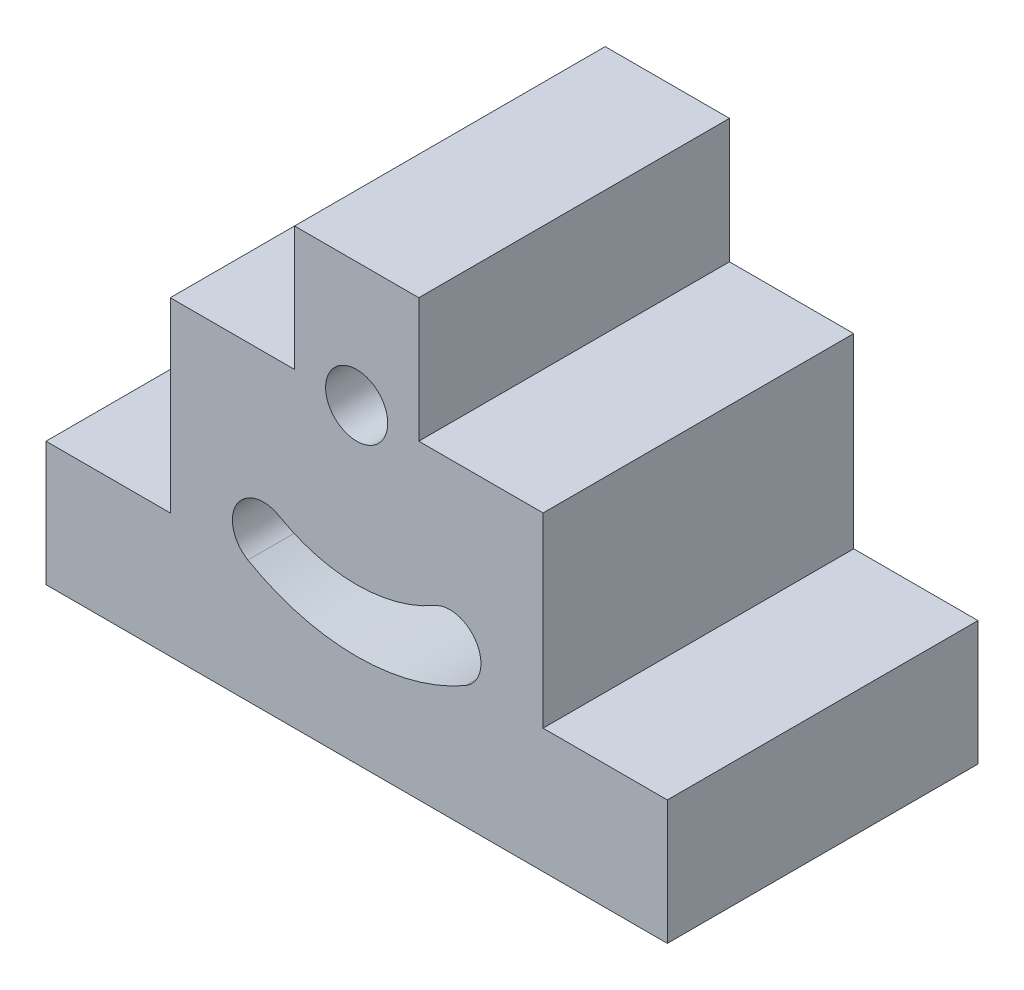
ISO-10303-21;
HEADER;
FILE_DESCRIPTION(('STEP AP214'),'2;1');
FILE_NAME('part.step','',(''),(''),'','','');
FILE_SCHEMA(('AUTOMOTIVE_DESIGN { 1 0 10303 214 1 1 1 1 }'));
ENDSEC;
DATA;
#1=APPLICATION_CONTEXT('core data for automotive mechanical design processes');
#2=APPLICATION_PROTOCOL_DEFINITION('international standard','automotive_design',2000,#1);
#3=PRODUCT_CONTEXT('',#1,'mechanical');
#4=PRODUCT('Part','Part','',(#3));
#5=PRODUCT_RELATED_PRODUCT_CATEGORY('part','',(#4));
#6=PRODUCT_DEFINITION_FORMATION('','',#4);
#7=PRODUCT_DEFINITION_CONTEXT('part definition',#1,'design');
#8=PRODUCT_DEFINITION('design','',#6,#7);
#9=PRODUCT_DEFINITION_SHAPE('','',#8);
#10=(LENGTH_UNIT() NAMED_UNIT(*) SI_UNIT(.MILLI.,.METRE.));
#11=(NAMED_UNIT(*) PLANE_ANGLE_UNIT() SI_UNIT($,.RADIAN.));
#12=(NAMED_UNIT(*) SI_UNIT($,.STERADIAN.) SOLID_ANGLE_UNIT());
#13=UNCERTAINTY_MEASURE_WITH_UNIT(LENGTH_MEASURE(1.E-05),#10,'distance_accuracy_value','');
#14=(GEOMETRIC_REPRESENTATION_CONTEXT(3) GLOBAL_UNCERTAINTY_ASSIGNED_CONTEXT((#13)) GLOBAL_UNIT_ASSIGNED_CONTEXT((#10,
#11,#12)) REPRESENTATION_CONTEXT('',''));
#15=CARTESIAN_POINT('',(0.,0.,0.));
#16=DIRECTION('',(0.,0.,1.));
#17=DIRECTION('',(1.,0.,0.));
#18=AXIS2_PLACEMENT_3D('',#15,#16,#17);
#19=CARTESIAN_POINT('',(0.,0.,2.5));
#20=DIRECTION('',(0.,0.,1.));
#21=DIRECTION('',(1.,0.,0.));
#22=AXIS2_PLACEMENT_3D('',#19,#20,#21);
#23=PLANE('',#22);
#24=CARTESIAN_POINT('',(0.,4.99999999999773,2.5));
#25=DIRECTION('',(0.,0.,1.));
#26=DIRECTION('',(1.,0.,0.));
#27=AXIS2_PLACEMENT_3D('',#24,#25,#26);
#28=CIRCLE('',#27,3.5);
#29=CARTESIAN_POINT('',(-1.75,1.96891108675219,2.5));
#30=VERTEX_POINT('',#29);
#31=CARTESIAN_POINT('',(1.75,1.96891108675219,2.5));
#32=VERTEX_POINT('',#31);
#33=EDGE_CURVE('E168',#30,#32,#28,.T.);
#34=ORIENTED_EDGE('',*,*,#33,.F.);
#35=CARTESIAN_POINT('',(-1.5,2.40192378864441,2.5));
#36=DIRECTION('',(0.,0.,1.));
#37=DIRECTION('',(1.,0.,0.));
#38=AXIS2_PLACEMENT_3D('',#35,#36,#37);
#39=CIRCLE('',#38,0.5);
#40=CARTESIAN_POINT('',(-1.25,2.83493649053663,2.5));
#41=VERTEX_POINT('',#40);
#42=EDGE_CURVE('E159',#41,#30,#39,.T.);
#43=ORIENTED_EDGE('',*,*,#42,.F.);
#44=CARTESIAN_POINT('',(0.,4.99999999999773,2.5));
#45=DIRECTION('',(0.,0.,-1.));
#46=DIRECTION('',(1.,0.,0.));
#47=AXIS2_PLACEMENT_3D('',#44,#45,#46);
#48=CIRCLE('',#47,2.5);
#49=CARTESIAN_POINT('',(1.25,2.83493649053663,2.5));
#50=VERTEX_POINT('',#49);
#51=EDGE_CURVE('E186',#50,#41,#48,.T.);
#52=ORIENTED_EDGE('',*,*,#51,.F.);
#53=CARTESIAN_POINT('',(1.5,2.40192378864441,2.5));
#54=DIRECTION('',(0.,0.,1.));
#55=DIRECTION('',(1.,0.,0.));
#56=AXIS2_PLACEMENT_3D('',#53,#54,#55);
#57=CIRCLE('',#56,0.5);
#58=EDGE_CURVE('E182',#32,#50,#57,.T.);
#59=ORIENTED_EDGE('',*,*,#58,.F.);
#60=EDGE_LOOP('',(#34,#43,#52,#59));
#61=FACE_BOUND('',#60,.T.);
#62=DIRECTION('',(-1.,0.,0.));
#63=VECTOR('',#62,1.);
#64=CARTESIAN_POINT('',(-5.,2.,2.5));
#65=LINE('',#64,#63);
#66=CARTESIAN_POINT('',(-3.,2.,2.5));
#67=VERTEX_POINT('',#66);
#68=CARTESIAN_POINT('',(-5.,2.,2.5));
#69=VERTEX_POINT('',#68);
#70=EDGE_CURVE('E210',#67,#69,#65,.T.);
#71=ORIENTED_EDGE('',*,*,#70,.T.);
#72=DIRECTION('',(0.,-1.,0.));
#73=VECTOR('',#72,1.);
#74=CARTESIAN_POINT('',(-5.,0.,2.5));
#75=LINE('',#74,#73);
#76=CARTESIAN_POINT('',(-5.,0.,2.5));
#77=VERTEX_POINT('',#76);
#78=EDGE_CURVE('E214',#69,#77,#75,.T.);
#79=ORIENTED_EDGE('',*,*,#78,.T.);
#80=DIRECTION('',(1.,0.,0.));
#81=VECTOR('',#80,1.);
#82=CARTESIAN_POINT('',(-5.,0.,2.5));
#83=LINE('',#82,#81);
#84=CARTESIAN_POINT('',(5.,0.,2.5));
#85=VERTEX_POINT('',#84);
#86=EDGE_CURVE('E218',#77,#85,#83,.T.);
#87=ORIENTED_EDGE('',*,*,#86,.T.);
#88=DIRECTION('',(0.,1.,0.));
#89=VECTOR('',#88,1.);
#90=CARTESIAN_POINT('',(5.,0.,2.5));
#91=LINE('',#90,#89);
#92=CARTESIAN_POINT('',(5.,2.,2.5));
#93=VERTEX_POINT('',#92);
#94=EDGE_CURVE('E221',#85,#93,#91,.T.);
#95=ORIENTED_EDGE('',*,*,#94,.T.);
#96=DIRECTION('',(-1.,0.,0.));
#97=VECTOR('',#96,1.);
#98=CARTESIAN_POINT('',(5.,2.,2.5));
#99=LINE('',#98,#97);
#100=CARTESIAN_POINT('',(3.,2.,2.5));
#101=VERTEX_POINT('',#100);
#102=EDGE_CURVE('E224',#93,#101,#99,.T.);
#103=ORIENTED_EDGE('',*,*,#102,.T.);
#104=DIRECTION('',(0.,1.,0.));
#105=VECTOR('',#104,1.);
#106=CARTESIAN_POINT('',(3.,2.,2.5));
#107=LINE('',#106,#105);
#108=CARTESIAN_POINT('',(3.,5.,2.5));
#109=VERTEX_POINT('',#108);
#110=EDGE_CURVE('E227',#101,#109,#107,.T.);
#111=ORIENTED_EDGE('',*,*,#110,.T.);
#112=DIRECTION('',(-1.,0.,0.));
#113=VECTOR('',#112,1.);
#114=CARTESIAN_POINT('',(3.,5.,2.5));
#115=LINE('',#114,#113);
#116=CARTESIAN_POINT('',(1.,5.,2.5));
#117=VERTEX_POINT('',#116);
#118=EDGE_CURVE('E230',#109,#117,#115,.T.);
#119=ORIENTED_EDGE('',*,*,#118,.T.);
#120=DIRECTION('',(0.,1.,0.));
#121=VECTOR('',#120,1.);
#122=CARTESIAN_POINT('',(1.,5.,2.5));
#123=LINE('',#122,#121);
#124=CARTESIAN_POINT('',(1.,7.,2.5));
#125=VERTEX_POINT('',#124);
#126=EDGE_CURVE('E233',#117,#125,#123,.T.);
#127=ORIENTED_EDGE('',*,*,#126,.T.);
#128=DIRECTION('',(-1.,0.,0.));
#129=VECTOR('',#128,1.);
#130=CARTESIAN_POINT('',(1.,7.,2.5));
#131=LINE('',#130,#129);
#132=CARTESIAN_POINT('',(-0.999999999999999,7.,2.5));
#133=VERTEX_POINT('',#132);
#134=EDGE_CURVE('E236',#125,#133,#131,.T.);
#135=ORIENTED_EDGE('',*,*,#134,.T.);
#136=DIRECTION('',(0.,-1.,0.));
#137=VECTOR('',#136,1.);
#138=CARTESIAN_POINT('',(-1.,5.,2.5));
#139=LINE('',#138,#137);
#140=CARTESIAN_POINT('',(-1.,5.,2.5));
#141=VERTEX_POINT('',#140);
#142=EDGE_CURVE('E239',#133,#141,#139,.T.);
#143=ORIENTED_EDGE('',*,*,#142,.T.);
#144=DIRECTION('',(-1.,0.,0.));
#145=VECTOR('',#144,1.);
#146=CARTESIAN_POINT('',(-3.,5.,2.5));
#147=LINE('',#146,#145);
#148=CARTESIAN_POINT('',(-3.,5.,2.5));
#149=VERTEX_POINT('',#148);
#150=EDGE_CURVE('E242',#141,#149,#147,.T.);
#151=ORIENTED_EDGE('',*,*,#150,.T.);
#152=DIRECTION('',(0.,-1.,0.));
#153=VECTOR('',#152,1.);
#154=CARTESIAN_POINT('',(-3.,2.,2.5));
#155=LINE('',#154,#153);
#156=EDGE_CURVE('E245',#149,#67,#155,.T.);
#157=ORIENTED_EDGE('',*,*,#156,.T.);
#158=EDGE_LOOP('',(#71,#79,#87,#95,#103,#111,#119,#127,#135,#143,#151,#157));
#159=FACE_BOUND('',#158,.T.);
#160=CARTESIAN_POINT('',(0.,4.99999999999773,2.5));
#161=DIRECTION('',(0.,0.,1.));
#162=DIRECTION('',(1.,0.,0.));
#163=AXIS2_PLACEMENT_3D('',#160,#161,#162);
#164=CIRCLE('',#163,0.5);
#165=CARTESIAN_POINT('',(0.5,4.99999999999773,2.5));
#166=VERTEX_POINT('',#165);
#167=EDGE_CURVE('E194',#166,#166,#164,.T.);
#168=ORIENTED_EDGE('',*,*,#167,.F.);
#169=EDGE_LOOP('',(#168));
#170=FACE_BOUND('',#169,.T.);
#171=ADVANCED_FACE('F45',(#61,#159,#170),#23,.T.);
#172=CARTESIAN_POINT('',(0.,0.,-2.5));
#173=DIRECTION('',(0.,0.,1.));
#174=DIRECTION('',(1.,0.,0.));
#175=AXIS2_PLACEMENT_3D('',#172,#173,#174);
#176=PLANE('',#175);
#177=DIRECTION('',(-1.,0.,0.));
#178=VECTOR('',#177,1.);
#179=CARTESIAN_POINT('',(-5.,2.,-2.5));
#180=LINE('',#179,#178);
#181=CARTESIAN_POINT('',(-3.,2.,-2.5));
#182=VERTEX_POINT('',#181);
#183=CARTESIAN_POINT('',(-5.,2.,-2.5));
#184=VERTEX_POINT('',#183);
#185=EDGE_CURVE('E177',#182,#184,#180,.T.);
#186=ORIENTED_EDGE('',*,*,#185,.F.);
#187=DIRECTION('',(0.,-1.,0.));
#188=VECTOR('',#187,1.);
#189=CARTESIAN_POINT('',(-3.,2.,-2.5));
#190=LINE('',#189,#188);
#191=CARTESIAN_POINT('',(-3.,5.,-2.5));
#192=VERTEX_POINT('',#191);
#193=EDGE_CURVE('E215',#192,#182,#190,.T.);
#194=ORIENTED_EDGE('',*,*,#193,.F.);
#195=DIRECTION('',(-1.,0.,0.));
#196=VECTOR('',#195,1.);
#197=CARTESIAN_POINT('',(-3.,5.,-2.5));
#198=LINE('',#197,#196);
#199=CARTESIAN_POINT('',(-1.,5.,-2.5));
#200=VERTEX_POINT('',#199);
#201=EDGE_CURVE('E279',#200,#192,#198,.T.);
#202=ORIENTED_EDGE('',*,*,#201,.F.);
#203=DIRECTION('',(0.,-1.,0.));
#204=VECTOR('',#203,1.);
#205=CARTESIAN_POINT('',(-1.,5.,-2.5));
#206=LINE('',#205,#204);
#207=CARTESIAN_POINT('',(-0.999999999999999,7.,-2.5));
#208=VERTEX_POINT('',#207);
#209=EDGE_CURVE('E276',#208,#200,#206,.T.);
#210=ORIENTED_EDGE('',*,*,#209,.F.);
#211=DIRECTION('',(-1.,0.,0.));
#212=VECTOR('',#211,1.);
#213=CARTESIAN_POINT('',(1.,7.,-2.5));
#214=LINE('',#213,#212);
#215=CARTESIAN_POINT('',(1.,7.,-2.5));
#216=VERTEX_POINT('',#215);
#217=EDGE_CURVE('E273',#216,#208,#214,.T.);
#218=ORIENTED_EDGE('',*,*,#217,.F.);
#219=DIRECTION('',(0.,1.,0.));
#220=VECTOR('',#219,1.);
#221=CARTESIAN_POINT('',(1.,5.,-2.5));
#222=LINE('',#221,#220);
#223=CARTESIAN_POINT('',(1.,5.,-2.5));
#224=VERTEX_POINT('',#223);
#225=EDGE_CURVE('E270',#224,#216,#222,.T.);
#226=ORIENTED_EDGE('',*,*,#225,.F.);
#227=DIRECTION('',(-1.,0.,0.));
#228=VECTOR('',#227,1.);
#229=CARTESIAN_POINT('',(3.,5.,-2.5));
#230=LINE('',#229,#228);
#231=CARTESIAN_POINT('',(3.,5.,-2.5));
#232=VERTEX_POINT('',#231);
#233=EDGE_CURVE('E267',#232,#224,#230,.T.);
#234=ORIENTED_EDGE('',*,*,#233,.F.);
#235=DIRECTION('',(0.,1.,0.));
#236=VECTOR('',#235,1.);
#237=CARTESIAN_POINT('',(3.,2.,-2.5));
#238=LINE('',#237,#236);
#239=CARTESIAN_POINT('',(3.,2.,-2.5));
#240=VERTEX_POINT('',#239);
#241=EDGE_CURVE('E264',#240,#232,#238,.T.);
#242=ORIENTED_EDGE('',*,*,#241,.F.);
#243=DIRECTION('',(-1.,0.,0.));
#244=VECTOR('',#243,1.);
#245=CARTESIAN_POINT('',(5.,2.,-2.5));
#246=LINE('',#245,#244);
#247=CARTESIAN_POINT('',(5.,2.,-2.5));
#248=VERTEX_POINT('',#247);
#249=EDGE_CURVE('E261',#248,#240,#246,.T.);
#250=ORIENTED_EDGE('',*,*,#249,.F.);
#251=DIRECTION('',(0.,1.,0.));
#252=VECTOR('',#251,1.);
#253=CARTESIAN_POINT('',(5.,0.,-2.5));
#254=LINE('',#253,#252);
#255=CARTESIAN_POINT('',(5.,0.,-2.5));
#256=VERTEX_POINT('',#255);
#257=EDGE_CURVE('E258',#256,#248,#254,.T.);
#258=ORIENTED_EDGE('',*,*,#257,.F.);
#259=DIRECTION('',(1.,0.,0.));
#260=VECTOR('',#259,1.);
#261=CARTESIAN_POINT('',(-5.,0.,-2.5));
#262=LINE('',#261,#260);
#263=CARTESIAN_POINT('',(-5.,0.,-2.5));
#264=VERTEX_POINT('',#263);
#265=EDGE_CURVE('E255',#264,#256,#262,.T.);
#266=ORIENTED_EDGE('',*,*,#265,.F.);
#267=DIRECTION('',(0.,-1.,0.));
#268=VECTOR('',#267,1.);
#269=CARTESIAN_POINT('',(-5.,0.,-2.5));
#270=LINE('',#269,#268);
#271=EDGE_CURVE('E252',#184,#264,#270,.T.);
#272=ORIENTED_EDGE('',*,*,#271,.F.);
#273=EDGE_LOOP('',(#186,#194,#202,#210,#218,#226,#234,#242,#250,#258,#266,#272));
#274=FACE_BOUND('',#273,.T.);
#275=CARTESIAN_POINT('',(-1.5,2.40192378864441,-2.5));
#276=DIRECTION('',(0.,0.,1.));
#277=DIRECTION('',(1.,0.,0.));
#278=AXIS2_PLACEMENT_3D('',#275,#276,#277);
#279=CIRCLE('',#278,0.5);
#280=CARTESIAN_POINT('',(-1.25,2.83493649053663,-2.5));
#281=VERTEX_POINT('',#280);
#282=CARTESIAN_POINT('',(-1.75,1.96891108675219,-2.5));
#283=VERTEX_POINT('',#282);
#284=EDGE_CURVE('E69',#281,#283,#279,.T.);
#285=ORIENTED_EDGE('',*,*,#284,.T.);
#286=CARTESIAN_POINT('',(0.,4.99999999999773,-2.5));
#287=DIRECTION('',(0.,0.,1.));
#288=DIRECTION('',(1.,0.,0.));
#289=AXIS2_PLACEMENT_3D('',#286,#287,#288);
#290=CIRCLE('',#289,3.5);
#291=CARTESIAN_POINT('',(1.75,1.96891108675219,-2.5));
#292=VERTEX_POINT('',#291);
#293=EDGE_CURVE('E175',#283,#292,#290,.T.);
#294=ORIENTED_EDGE('',*,*,#293,.T.);
#295=CARTESIAN_POINT('',(1.5,2.40192378864441,-2.5));
#296=DIRECTION('',(0.,0.,1.));
#297=DIRECTION('',(1.,0.,0.));
#298=AXIS2_PLACEMENT_3D('',#295,#296,#297);
#299=CIRCLE('',#298,0.5);
#300=CARTESIAN_POINT('',(1.25,2.83493649053663,-2.5));
#301=VERTEX_POINT('',#300);
#302=EDGE_CURVE('E197',#292,#301,#299,.T.);
#303=ORIENTED_EDGE('',*,*,#302,.T.);
#304=CARTESIAN_POINT('',(0.,4.99999999999773,-2.5));
#305=DIRECTION('',(0.,0.,-1.));
#306=DIRECTION('',(1.,0.,0.));
#307=AXIS2_PLACEMENT_3D('',#304,#305,#306);
#308=CIRCLE('',#307,2.5);
#309=EDGE_CURVE('E169',#301,#281,#308,.T.);
#310=ORIENTED_EDGE('',*,*,#309,.T.);
#311=EDGE_LOOP('',(#285,#294,#303,#310));
#312=FACE_BOUND('',#311,.T.);
#313=CARTESIAN_POINT('',(0.,4.99999999999773,-2.5));
#314=DIRECTION('',(0.,0.,1.));
#315=DIRECTION('',(1.,0.,0.));
#316=AXIS2_PLACEMENT_3D('',#313,#314,#315);
#317=CIRCLE('',#316,0.5);
#318=CARTESIAN_POINT('',(0.5,4.99999999999773,-2.5));
#319=VERTEX_POINT('',#318);
#320=EDGE_CURVE('E545',#319,#319,#317,.T.);
#321=ORIENTED_EDGE('',*,*,#320,.T.);
#322=EDGE_LOOP('',(#321));
#323=FACE_BOUND('',#322,.T.);
#324=ADVANCED_FACE('F334',(#274,#312,#323),#176,.F.);
#325=CARTESIAN_POINT('',(-5.,2.,2.5));
#326=DIRECTION('',(0.,-1.,0.));
#327=DIRECTION('',(0.,0.,-1.));
#328=AXIS2_PLACEMENT_3D('',#325,#326,#327);
#329=PLANE('',#328);
#330=ORIENTED_EDGE('',*,*,#185,.T.);
#331=DIRECTION('',(0.,0.,-1.));
#332=VECTOR('',#331,1.);
#333=CARTESIAN_POINT('',(-5.,2.,2.5));
#334=LINE('',#333,#332);
#335=EDGE_CURVE('E11',#69,#184,#334,.T.);
#336=ORIENTED_EDGE('',*,*,#335,.F.);
#337=ORIENTED_EDGE('',*,*,#70,.F.);
#338=DIRECTION('',(0.,0.,-1.));
#339=VECTOR('',#338,1.);
#340=CARTESIAN_POINT('',(-3.,2.,2.5));
#341=LINE('',#340,#339);
#342=EDGE_CURVE('E248',#67,#182,#341,.T.);
#343=ORIENTED_EDGE('',*,*,#342,.T.);
#344=EDGE_LOOP('',(#330,#336,#337,#343));
#345=FACE_BOUND('',#344,.T.);
#346=ADVANCED_FACE('F47',(#345),#329,.F.);
#347=CARTESIAN_POINT('',(-5.,0.,2.5));
#348=DIRECTION('',(1.,0.,0.));
#349=DIRECTION('',(0.,0.,-1.));
#350=AXIS2_PLACEMENT_3D('',#347,#348,#349);
#351=PLANE('',#350);
#352=ORIENTED_EDGE('',*,*,#271,.T.);
#353=DIRECTION('',(0.,0.,-1.));
#354=VECTOR('',#353,1.);
#355=CARTESIAN_POINT('',(-5.,0.,2.5));
#356=LINE('',#355,#354);
#357=EDGE_CURVE('E54',#77,#264,#356,.T.);
#358=ORIENTED_EDGE('',*,*,#357,.F.);
#359=ORIENTED_EDGE('',*,*,#78,.F.);
#360=ORIENTED_EDGE('',*,*,#335,.T.);
#361=EDGE_LOOP('',(#352,#358,#359,#360));
#362=FACE_BOUND('',#361,.T.);
#363=ADVANCED_FACE('F351',(#362),#351,.F.);
#364=CARTESIAN_POINT('',(-5.,0.,2.5));
#365=DIRECTION('',(0.,1.,0.));
#366=DIRECTION('',(0.,0.,1.));
#367=AXIS2_PLACEMENT_3D('',#364,#365,#366);
#368=PLANE('',#367);
#369=ORIENTED_EDGE('',*,*,#265,.T.);
#370=DIRECTION('',(0.,0.,-1.));
#371=VECTOR('',#370,1.);
#372=CARTESIAN_POINT('',(5.,0.,2.5));
#373=LINE('',#372,#371);
#374=EDGE_CURVE('E319',#85,#256,#373,.T.);
#375=ORIENTED_EDGE('',*,*,#374,.F.);
#376=ORIENTED_EDGE('',*,*,#86,.F.);
#377=ORIENTED_EDGE('',*,*,#357,.T.);
#378=EDGE_LOOP('',(#369,#375,#376,#377));
#379=FACE_BOUND('',#378,.T.);
#380=ADVANCED_FACE('F328',(#379),#368,.F.);
#381=CARTESIAN_POINT('',(5.,0.,2.5));
#382=DIRECTION('',(-1.,0.,0.));
#383=DIRECTION('',(0.,0.,1.));
#384=AXIS2_PLACEMENT_3D('',#381,#382,#383);
#385=PLANE('',#384);
#386=ORIENTED_EDGE('',*,*,#257,.T.);
#387=DIRECTION('',(0.,0.,-1.));
#388=VECTOR('',#387,1.);
#389=CARTESIAN_POINT('',(5.,2.,2.5));
#390=LINE('',#389,#388);
#391=EDGE_CURVE('E315',#93,#248,#390,.T.);
#392=ORIENTED_EDGE('',*,*,#391,.F.);
#393=ORIENTED_EDGE('',*,*,#94,.F.);
#394=ORIENTED_EDGE('',*,*,#374,.T.);
#395=EDGE_LOOP('',(#386,#392,#393,#394));
#396=FACE_BOUND('',#395,.T.);
#397=ADVANCED_FACE('F340',(#396),#385,.F.);
#398=CARTESIAN_POINT('',(5.,2.,2.5));
#399=DIRECTION('',(0.,-1.,0.));
#400=DIRECTION('',(1.,0.,0.));
#401=AXIS2_PLACEMENT_3D('',#398,#399,#400);
#402=PLANE('',#401);
#403=ORIENTED_EDGE('',*,*,#249,.T.);
#404=DIRECTION('',(0.,0.,-1.));
#405=VECTOR('',#404,1.);
#406=CARTESIAN_POINT('',(3.,2.,2.5));
#407=LINE('',#406,#405);
#408=EDGE_CURVE('E311',#101,#240,#407,.T.);
#409=ORIENTED_EDGE('',*,*,#408,.F.);
#410=ORIENTED_EDGE('',*,*,#102,.F.);
#411=ORIENTED_EDGE('',*,*,#391,.T.);
#412=EDGE_LOOP('',(#403,#409,#410,#411));
#413=FACE_BOUND('',#412,.T.);
#414=ADVANCED_FACE('F344',(#413),#402,.F.);
#415=CARTESIAN_POINT('',(3.,2.,2.5));
#416=DIRECTION('',(-1.,0.,0.));
#417=DIRECTION('',(0.,0.,1.));
#418=AXIS2_PLACEMENT_3D('',#415,#416,#417);
#419=PLANE('',#418);
#420=ORIENTED_EDGE('',*,*,#241,.T.);
#421=DIRECTION('',(0.,0.,-1.));
#422=VECTOR('',#421,1.);
#423=CARTESIAN_POINT('',(3.,5.,2.5));
#424=LINE('',#423,#422);
#425=EDGE_CURVE('E307',#109,#232,#424,.T.);
#426=ORIENTED_EDGE('',*,*,#425,.F.);
#427=ORIENTED_EDGE('',*,*,#110,.F.);
#428=ORIENTED_EDGE('',*,*,#408,.T.);
#429=EDGE_LOOP('',(#420,#426,#427,#428));
#430=FACE_BOUND('',#429,.T.);
#431=ADVANCED_FACE('F384',(#430),#419,.F.);
#432=CARTESIAN_POINT('',(3.,5.,2.5));
#433=DIRECTION('',(0.,-1.,0.));
#434=DIRECTION('',(1.,0.,0.));
#435=AXIS2_PLACEMENT_3D('',#432,#433,#434);
#436=PLANE('',#435);
#437=ORIENTED_EDGE('',*,*,#233,.T.);
#438=DIRECTION('',(0.,0.,-1.));
#439=VECTOR('',#438,1.);
#440=CARTESIAN_POINT('',(1.,5.,2.5));
#441=LINE('',#440,#439);
#442=EDGE_CURVE('E303',#117,#224,#441,.T.);
#443=ORIENTED_EDGE('',*,*,#442,.F.);
#444=ORIENTED_EDGE('',*,*,#118,.F.);
#445=ORIENTED_EDGE('',*,*,#425,.T.);
#446=EDGE_LOOP('',(#437,#443,#444,#445));
#447=FACE_BOUND('',#446,.T.);
#448=ADVANCED_FACE('F382',(#447),#436,.F.);
#449=CARTESIAN_POINT('',(1.,5.,2.5));
#450=DIRECTION('',(-1.,0.,0.));
#451=DIRECTION('',(0.,0.,1.));
#452=AXIS2_PLACEMENT_3D('',#449,#450,#451);
#453=PLANE('',#452);
#454=ORIENTED_EDGE('',*,*,#225,.T.);
#455=DIRECTION('',(0.,0.,-1.));
#456=VECTOR('',#455,1.);
#457=CARTESIAN_POINT('',(1.,7.,2.5));
#458=LINE('',#457,#456);
#459=EDGE_CURVE('E299',#125,#216,#458,.T.);
#460=ORIENTED_EDGE('',*,*,#459,.F.);
#461=ORIENTED_EDGE('',*,*,#126,.F.);
#462=ORIENTED_EDGE('',*,*,#442,.T.);
#463=EDGE_LOOP('',(#454,#460,#461,#462));
#464=FACE_BOUND('',#463,.T.);
#465=ADVANCED_FACE('F378',(#464),#453,.F.);
#466=CARTESIAN_POINT('',(1.,7.,2.5));
#467=DIRECTION('',(0.,-1.,0.));
#468=DIRECTION('',(0.,0.,-1.));
#469=AXIS2_PLACEMENT_3D('',#466,#467,#468);
#470=PLANE('',#469);
#471=ORIENTED_EDGE('',*,*,#217,.T.);
#472=DIRECTION('',(0.,0.,-1.));
#473=VECTOR('',#472,1.);
#474=CARTESIAN_POINT('',(-0.999999999999999,7.,2.5));
#475=LINE('',#474,#473);
#476=EDGE_CURVE('E295',#133,#208,#475,.T.);
#477=ORIENTED_EDGE('',*,*,#476,.F.);
#478=ORIENTED_EDGE('',*,*,#134,.F.);
#479=ORIENTED_EDGE('',*,*,#459,.T.);
#480=EDGE_LOOP('',(#471,#477,#478,#479));
#481=FACE_BOUND('',#480,.T.);
#482=ADVANCED_FACE('F373',(#481),#470,.F.);
#483=CARTESIAN_POINT('',(-1.,5.,2.5));
#484=DIRECTION('',(1.,0.,0.));
#485=DIRECTION('',(0.,1.,0.));
#486=AXIS2_PLACEMENT_3D('',#483,#484,#485);
#487=PLANE('',#486);
#488=ORIENTED_EDGE('',*,*,#209,.T.);
#489=DIRECTION('',(0.,0.,-1.));
#490=VECTOR('',#489,1.);
#491=CARTESIAN_POINT('',(-1.,5.,2.5));
#492=LINE('',#491,#490);
#493=EDGE_CURVE('E291',#141,#200,#492,.T.);
#494=ORIENTED_EDGE('',*,*,#493,.F.);
#495=ORIENTED_EDGE('',*,*,#142,.F.);
#496=ORIENTED_EDGE('',*,*,#476,.T.);
#497=EDGE_LOOP('',(#488,#494,#495,#496));
#498=FACE_BOUND('',#497,.T.);
#499=ADVANCED_FACE('F367',(#498),#487,.F.);
#500=CARTESIAN_POINT('',(-3.,5.,2.5));
#501=DIRECTION('',(0.,-1.,0.));
#502=DIRECTION('',(0.,0.,-1.));
#503=AXIS2_PLACEMENT_3D('',#500,#501,#502);
#504=PLANE('',#503);
#505=ORIENTED_EDGE('',*,*,#201,.T.);
#506=DIRECTION('',(0.,0.,-1.));
#507=VECTOR('',#506,1.);
#508=CARTESIAN_POINT('',(-3.,5.,2.5));
#509=LINE('',#508,#507);
#510=EDGE_CURVE('E287',#149,#192,#509,.T.);
#511=ORIENTED_EDGE('',*,*,#510,.F.);
#512=ORIENTED_EDGE('',*,*,#150,.F.);
#513=ORIENTED_EDGE('',*,*,#493,.T.);
#514=EDGE_LOOP('',(#505,#511,#512,#513));
#515=FACE_BOUND('',#514,.T.);
#516=ADVANCED_FACE('F363',(#515),#504,.F.);
#517=CARTESIAN_POINT('',(-3.,2.,2.5));
#518=DIRECTION('',(1.,0.,0.));
#519=DIRECTION('',(0.,0.,-1.));
#520=AXIS2_PLACEMENT_3D('',#517,#518,#519);
#521=PLANE('',#520);
#522=ORIENTED_EDGE('',*,*,#193,.T.);
#523=ORIENTED_EDGE('',*,*,#342,.F.);
#524=ORIENTED_EDGE('',*,*,#156,.F.);
#525=ORIENTED_EDGE('',*,*,#510,.T.);
#526=EDGE_LOOP('',(#522,#523,#524,#525));
#527=FACE_BOUND('',#526,.T.);
#528=ADVANCED_FACE('F358',(#527),#521,.F.);
#529=CARTESIAN_POINT('',(-1.5,2.40192378864441,2.5));
#530=DIRECTION('',(0.,0.,-1.));
#531=DIRECTION('',(-1.,0.,0.));
#532=AXIS2_PLACEMENT_3D('',#529,#530,#531);
#533=CYLINDRICAL_SURFACE('',#532,0.5);
#534=ORIENTED_EDGE('',*,*,#284,.F.);
#535=DIRECTION('',(0.,0.,-1.));
#536=VECTOR('',#535,1.);
#537=CARTESIAN_POINT('',(-1.25,2.83493649053663,2.5));
#538=LINE('',#537,#536);
#539=EDGE_CURVE('E163',#41,#281,#538,.T.);
#540=ORIENTED_EDGE('',*,*,#539,.F.);
#541=ORIENTED_EDGE('',*,*,#42,.T.);
#542=DIRECTION('',(0.,0.,-1.));
#543=VECTOR('',#542,1.);
#544=CARTESIAN_POINT('',(-1.75,1.96891108675219,2.5));
#545=LINE('',#544,#543);
#546=EDGE_CURVE('E162',#30,#283,#545,.T.);
#547=ORIENTED_EDGE('',*,*,#546,.T.);
#548=EDGE_LOOP('',(#534,#540,#541,#547));
#549=FACE_BOUND('',#548,.T.);
#550=ADVANCED_FACE('F161',(#549),#533,.F.);
#551=CARTESIAN_POINT('',(0.,4.99999999999773,2.5));
#552=DIRECTION('',(0.,0.,-1.));
#553=DIRECTION('',(-1.,0.,0.));
#554=AXIS2_PLACEMENT_3D('',#551,#552,#553);
#555=CYLINDRICAL_SURFACE('',#554,3.5);
#556=ORIENTED_EDGE('',*,*,#293,.F.);
#557=ORIENTED_EDGE('',*,*,#546,.F.);
#558=ORIENTED_EDGE('',*,*,#33,.T.);
#559=DIRECTION('',(0.,0.,-1.));
#560=VECTOR('',#559,1.);
#561=CARTESIAN_POINT('',(1.75,1.96891108675219,2.5));
#562=LINE('',#561,#560);
#563=EDGE_CURVE('E178',#32,#292,#562,.T.);
#564=ORIENTED_EDGE('',*,*,#563,.T.);
#565=EDGE_LOOP('',(#556,#557,#558,#564));
#566=FACE_BOUND('',#565,.T.);
#567=ADVANCED_FACE('F172',(#566),#555,.F.);
#568=CARTESIAN_POINT('',(1.5,2.40192378864441,2.5));
#569=DIRECTION('',(0.,0.,-1.));
#570=DIRECTION('',(-1.,0.,0.));
#571=AXIS2_PLACEMENT_3D('',#568,#569,#570);
#572=CYLINDRICAL_SURFACE('',#571,0.5);
#573=ORIENTED_EDGE('',*,*,#302,.F.);
#574=ORIENTED_EDGE('',*,*,#563,.F.);
#575=ORIENTED_EDGE('',*,*,#58,.T.);
#576=DIRECTION('',(0.,0.,-1.));
#577=VECTOR('',#576,1.);
#578=CARTESIAN_POINT('',(1.25,2.83493649053663,2.5));
#579=LINE('',#578,#577);
#580=EDGE_CURVE('E61',#50,#301,#579,.T.);
#581=ORIENTED_EDGE('',*,*,#580,.T.);
#582=EDGE_LOOP('',(#573,#574,#575,#581));
#583=FACE_BOUND('',#582,.T.);
#584=ADVANCED_FACE('F448',(#583),#572,.F.);
#585=CARTESIAN_POINT('',(0.,4.99999999999773,2.5));
#586=DIRECTION('',(0.,0.,-1.));
#587=DIRECTION('',(-1.,0.,0.));
#588=AXIS2_PLACEMENT_3D('',#585,#586,#587);
#589=CYLINDRICAL_SURFACE('',#588,2.5);
#590=ORIENTED_EDGE('',*,*,#309,.F.);
#591=ORIENTED_EDGE('',*,*,#580,.F.);
#592=ORIENTED_EDGE('',*,*,#51,.T.);
#593=ORIENTED_EDGE('',*,*,#539,.T.);
#594=EDGE_LOOP('',(#590,#591,#592,#593));
#595=FACE_BOUND('',#594,.T.);
#596=ADVANCED_FACE('F455',(#595),#589,.T.);
#597=CARTESIAN_POINT('',(0.,4.99999999999773,2.5));
#598=DIRECTION('',(0.,0.,-1.));
#599=DIRECTION('',(-1.,0.,0.));
#600=AXIS2_PLACEMENT_3D('',#597,#598,#599);
#601=CYLINDRICAL_SURFACE('',#600,0.5);
#602=ORIENTED_EDGE('',*,*,#167,.T.);
#603=EDGE_LOOP('',(#602));
#604=FACE_BOUND('',#603,.T.);
#605=ORIENTED_EDGE('',*,*,#320,.F.);
#606=EDGE_LOOP('',(#605));
#607=FACE_BOUND('',#606,.T.);
#608=ADVANCED_FACE('F464',(#604,#607),#601,.F.);
#609=CLOSED_SHELL('',(#171,#324,#346,#363,#380,#397,#414,#431,#448,#465,#482,#499,#516,#528,
#550,#567,#584,#596,#608));
#610=MANIFOLD_SOLID_BREP('B2',#609);
#611=ADVANCED_BREP_SHAPE_REPRESENTATION('',(#18,#610),#14);
#612=SHAPE_DEFINITION_REPRESENTATION(#9,#611);
ENDSEC;
END-ISO-10303-21;
